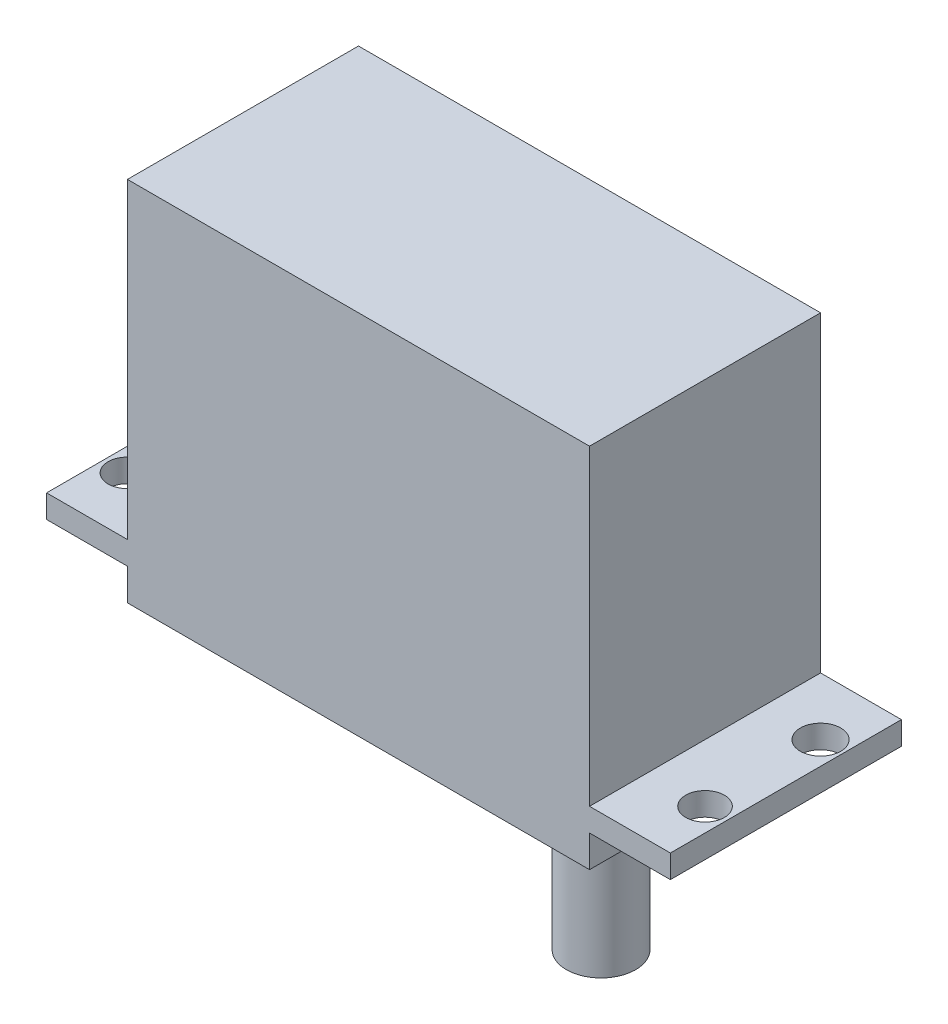
ISO-10303-21;
HEADER;
FILE_DESCRIPTION(('STEP AP214'),'2;1');
FILE_NAME('part.step','',(''),(''),'','','');
FILE_SCHEMA(('AUTOMOTIVE_DESIGN { 1 0 10303 214 1 1 1 1 }'));
ENDSEC;
DATA;
#1=APPLICATION_CONTEXT('core data for automotive mechanical design processes');
#2=APPLICATION_PROTOCOL_DEFINITION('international standard','automotive_design',2000,#1);
#3=PRODUCT_CONTEXT('',#1,'mechanical');
#4=PRODUCT('Part','Part','',(#3));
#5=PRODUCT_RELATED_PRODUCT_CATEGORY('part','',(#4));
#6=PRODUCT_DEFINITION_FORMATION('','',#4);
#7=PRODUCT_DEFINITION_CONTEXT('part definition',#1,'design');
#8=PRODUCT_DEFINITION('design','',#6,#7);
#9=PRODUCT_DEFINITION_SHAPE('','',#8);
#10=(LENGTH_UNIT() NAMED_UNIT(*) SI_UNIT(.MILLI.,.METRE.));
#11=(NAMED_UNIT(*) PLANE_ANGLE_UNIT() SI_UNIT($,.RADIAN.));
#12=(NAMED_UNIT(*) SI_UNIT($,.STERADIAN.) SOLID_ANGLE_UNIT());
#13=UNCERTAINTY_MEASURE_WITH_UNIT(LENGTH_MEASURE(1.E-05),#10,'distance_accuracy_value','');
#14=(GEOMETRIC_REPRESENTATION_CONTEXT(3) GLOBAL_UNCERTAINTY_ASSIGNED_CONTEXT((#13)) GLOBAL_UNIT_ASSIGNED_CONTEXT((#10,
#11,#12)) REPRESENTATION_CONTEXT('',''));
#15=CARTESIAN_POINT('',(0.,0.,0.));
#16=DIRECTION('',(0.,0.,1.));
#17=DIRECTION('',(1.,0.,0.));
#18=AXIS2_PLACEMENT_3D('',#15,#16,#17);
#19=CARTESIAN_POINT('',(0.,-15.,0.));
#20=DIRECTION('',(0.,-1.,0.));
#21=DIRECTION('',(0.,0.,-1.));
#22=AXIS2_PLACEMENT_3D('',#19,#20,#21);
#23=PLANE('',#22);
#24=CARTESIAN_POINT('',(-22.8039215686274,-15.,3.94117647058824));
#25=DIRECTION('',(0.,-1.,0.));
#26=DIRECTION('',(0.,0.,-1.));
#27=AXIS2_PLACEMENT_3D('',#24,#25,#26);
#28=CIRCLE('',#27,1.67357151142241);
#29=CARTESIAN_POINT('',(-22.8039215686274,-15.,2.26760495916582));
#30=VERTEX_POINT('',#29);
#31=EDGE_CURVE('E257',#30,#30,#28,.T.);
#32=ORIENTED_EDGE('',*,*,#31,.F.);
#33=EDGE_LOOP('',(#32));
#34=FACE_BOUND('',#33,.T.);
#35=CARTESIAN_POINT('',(-22.8039215686274,-15.,-6.05882352941176));
#36=DIRECTION('',(0.,-1.,0.));
#37=DIRECTION('',(0.,0.,-1.));
#38=AXIS2_PLACEMENT_3D('',#35,#36,#37);
#39=CIRCLE('',#38,1.749374087696);
#40=CARTESIAN_POINT('',(-22.8039215686274,-15.,-7.80819761710777));
#41=VERTEX_POINT('',#40);
#42=EDGE_CURVE('E269',#41,#41,#39,.T.);
#43=ORIENTED_EDGE('',*,*,#42,.F.);
#44=EDGE_LOOP('',(#43));
#45=FACE_BOUND('',#44,.T.);
#46=DIRECTION('',(1.,0.,0.));
#47=VECTOR('',#46,1.);
#48=CARTESIAN_POINT('',(-24.8039215686274,-15.,-11.0588235294118));
#49=LINE('',#48,#47);
#50=CARTESIAN_POINT('',(-24.8039215686274,-15.,-11.0588235294118));
#51=VERTEX_POINT('',#50);
#52=CARTESIAN_POINT('',(-17.8039215686274,-15.,-11.0588235294118));
#53=VERTEX_POINT('',#52);
#54=EDGE_CURVE('E177',#51,#53,#49,.T.);
#55=ORIENTED_EDGE('',*,*,#54,.T.);
#56=DIRECTION('',(0.,0.,1.));
#57=VECTOR('',#56,1.);
#58=CARTESIAN_POINT('',(-17.8039215686274,-15.,0.));
#59=LINE('',#58,#57);
#60=CARTESIAN_POINT('',(-17.8039215686274,-15.,8.94117647058824));
#61=VERTEX_POINT('',#60);
#62=EDGE_CURVE('E11',#53,#61,#59,.T.);
#63=ORIENTED_EDGE('',*,*,#62,.T.);
#64=DIRECTION('',(-1.,0.,0.));
#65=VECTOR('',#64,1.);
#66=CARTESIAN_POINT('',(-24.8039215686274,-15.,8.94117647058824));
#67=LINE('',#66,#65);
#68=CARTESIAN_POINT('',(-24.8039215686274,-15.,8.94117647058824));
#69=VERTEX_POINT('',#68);
#70=EDGE_CURVE('E183',#61,#69,#67,.T.);
#71=ORIENTED_EDGE('',*,*,#70,.T.);
#72=DIRECTION('',(0.,0.,-1.));
#73=VECTOR('',#72,1.);
#74=CARTESIAN_POINT('',(-24.8039215686274,-15.,8.94117647058824));
#75=LINE('',#74,#73);
#76=EDGE_CURVE('E171',#69,#51,#75,.T.);
#77=ORIENTED_EDGE('',*,*,#76,.T.);
#78=EDGE_LOOP('',(#55,#63,#71,#77));
#79=FACE_BOUND('',#78,.T.);
#80=ADVANCED_FACE('F45',(#34,#45,#79),#23,.T.);
#81=CARTESIAN_POINT('',(27.1960784313726,-15.,3.94117647058824));
#82=DIRECTION('',(0.,1.,0.));
#83=DIRECTION('',(0.,0.,-1.));
#84=AXIS2_PLACEMENT_3D('',#81,#82,#83);
#85=CIRCLE('',#84,1.67357151142241);
#86=CARTESIAN_POINT('',(27.1960784313726,-15.,2.26760495916582));
#87=VERTEX_POINT('',#86);
#88=EDGE_CURVE('E263',#87,#87,#85,.T.);
#89=ORIENTED_EDGE('',*,*,#88,.T.);
#90=EDGE_LOOP('',(#89));
#91=FACE_BOUND('',#90,.T.);
#92=CARTESIAN_POINT('',(27.1960784313726,-15.,-6.05882352941176));
#93=DIRECTION('',(0.,1.,0.));
#94=DIRECTION('',(0.,0.,-1.));
#95=AXIS2_PLACEMENT_3D('',#92,#93,#94);
#96=CIRCLE('',#95,1.749374087696);
#97=CARTESIAN_POINT('',(27.1960784313726,-15.,-7.80819761710777));
#98=VERTEX_POINT('',#97);
#99=EDGE_CURVE('E271',#98,#98,#96,.T.);
#100=ORIENTED_EDGE('',*,*,#99,.T.);
#101=EDGE_LOOP('',(#100));
#102=FACE_BOUND('',#101,.T.);
#103=CARTESIAN_POINT('',(29.1960784313726,-15.,8.94117647058824));
#104=VERTEX_POINT('',#103);
#105=CARTESIAN_POINT('',(22.1960784313726,-15.,8.94117647058824));
#106=VERTEX_POINT('',#105);
#107=EDGE_CURVE('E63',#104,#106,#67,.T.);
#108=ORIENTED_EDGE('',*,*,#107,.T.);
#109=DIRECTION('',(0.,0.,-1.));
#110=VECTOR('',#109,1.);
#111=CARTESIAN_POINT('',(22.1960784313726,-15.,0.));
#112=LINE('',#111,#110);
#113=CARTESIAN_POINT('',(22.1960784313726,-15.,-11.0588235294118));
#114=VERTEX_POINT('',#113);
#115=EDGE_CURVE('E55',#106,#114,#112,.T.);
#116=ORIENTED_EDGE('',*,*,#115,.T.);
#117=CARTESIAN_POINT('',(29.1960784313726,-15.,-11.0588235294118));
#118=VERTEX_POINT('',#117);
#119=EDGE_CURVE('E175',#114,#118,#49,.T.);
#120=ORIENTED_EDGE('',*,*,#119,.T.);
#121=DIRECTION('',(0.,0.,1.));
#122=VECTOR('',#121,1.);
#123=CARTESIAN_POINT('',(29.1960784313726,-15.,8.94117647058824));
#124=LINE('',#123,#122);
#125=EDGE_CURVE('E180',#118,#104,#124,.T.);
#126=ORIENTED_EDGE('',*,*,#125,.T.);
#127=EDGE_LOOP('',(#108,#116,#120,#126));
#128=FACE_BOUND('',#127,.T.);
#129=ADVANCED_FACE('F313',(#91,#102,#128),#23,.T.);
#130=CARTESIAN_POINT('',(-17.8039215686274,14.,-11.0588235294118));
#131=DIRECTION('',(1.,0.,0.));
#132=DIRECTION('',(0.,0.,-1.));
#133=AXIS2_PLACEMENT_3D('',#130,#131,#132);
#134=PLANE('',#133);
#135=DIRECTION('',(0.,0.,-1.));
#136=VECTOR('',#135,1.);
#137=CARTESIAN_POINT('',(-17.8039215686274,-13.,-11.0588235294118));
#138=LINE('',#137,#136);
#139=CARTESIAN_POINT('',(-17.8039215686274,-13.,8.94117647058824));
#140=VERTEX_POINT('',#139);
#141=CARTESIAN_POINT('',(-17.8039215686274,-13.,-11.0588235294118));
#142=VERTEX_POINT('',#141);
#143=EDGE_CURVE('E217',#140,#142,#138,.T.);
#144=ORIENTED_EDGE('',*,*,#143,.F.);
#145=DIRECTION('',(0.,-1.,0.));
#146=VECTOR('',#145,1.);
#147=CARTESIAN_POINT('',(-17.8039215686274,14.,8.94117647058824));
#148=LINE('',#147,#146);
#149=CARTESIAN_POINT('',(-17.8039215686274,14.,8.94117647058824));
#150=VERTEX_POINT('',#149);
#151=EDGE_CURVE('E243',#150,#140,#148,.T.);
#152=ORIENTED_EDGE('',*,*,#151,.F.);
#153=DIRECTION('',(0.,0.,1.));
#154=VECTOR('',#153,1.);
#155=CARTESIAN_POINT('',(-17.8039215686274,14.,-11.0588235294118));
#156=LINE('',#155,#154);
#157=CARTESIAN_POINT('',(-17.8039215686274,14.,-11.0588235294118));
#158=VERTEX_POINT('',#157);
#159=EDGE_CURVE('E221',#158,#150,#156,.T.);
#160=ORIENTED_EDGE('',*,*,#159,.F.);
#161=DIRECTION('',(0.,-1.,0.));
#162=VECTOR('',#161,1.);
#163=CARTESIAN_POINT('',(-17.8039215686274,14.,-11.0588235294118));
#164=LINE('',#163,#162);
#165=EDGE_CURVE('E234',#158,#142,#164,.T.);
#166=ORIENTED_EDGE('',*,*,#165,.T.);
#167=EDGE_LOOP('',(#144,#152,#160,#166));
#168=FACE_BOUND('',#167,.T.);
#169=ADVANCED_FACE('F47',(#168),#134,.F.);
#170=CARTESIAN_POINT('',(22.1960784313726,14.,-11.0588235294118));
#171=DIRECTION('',(-1.,0.,0.));
#172=DIRECTION('',(0.,0.,1.));
#173=AXIS2_PLACEMENT_3D('',#170,#171,#172);
#174=PLANE('',#173);
#175=DIRECTION('',(0.,0.,1.));
#176=VECTOR('',#175,1.);
#177=CARTESIAN_POINT('',(22.1960784313726,-13.,-11.0588235294118));
#178=LINE('',#177,#176);
#179=CARTESIAN_POINT('',(22.1960784313726,-13.,-11.0588235294118));
#180=VERTEX_POINT('',#179);
#181=CARTESIAN_POINT('',(22.1960784313726,-13.,8.94117647058824));
#182=VERTEX_POINT('',#181);
#183=EDGE_CURVE('E213',#180,#182,#178,.T.);
#184=ORIENTED_EDGE('',*,*,#183,.F.);
#185=DIRECTION('',(0.,-1.,0.));
#186=VECTOR('',#185,1.);
#187=CARTESIAN_POINT('',(22.1960784313726,14.,-11.0588235294118));
#188=LINE('',#187,#186);
#189=CARTESIAN_POINT('',(22.1960784313726,14.,-11.0588235294118));
#190=VERTEX_POINT('',#189);
#191=EDGE_CURVE('E237',#190,#180,#188,.T.);
#192=ORIENTED_EDGE('',*,*,#191,.F.);
#193=DIRECTION('',(0.,0.,-1.));
#194=VECTOR('',#193,1.);
#195=CARTESIAN_POINT('',(22.1960784313726,14.,-11.0588235294118));
#196=LINE('',#195,#194);
#197=CARTESIAN_POINT('',(22.1960784313726,14.,8.94117647058824));
#198=VERTEX_POINT('',#197);
#199=EDGE_CURVE('E228',#198,#190,#196,.T.);
#200=ORIENTED_EDGE('',*,*,#199,.F.);
#201=DIRECTION('',(0.,-1.,0.));
#202=VECTOR('',#201,1.);
#203=CARTESIAN_POINT('',(22.1960784313726,14.,8.94117647058824));
#204=LINE('',#203,#202);
#205=EDGE_CURVE('E240',#198,#182,#204,.T.);
#206=ORIENTED_EDGE('',*,*,#205,.T.);
#207=EDGE_LOOP('',(#184,#192,#200,#206));
#208=FACE_BOUND('',#207,.T.);
#209=ADVANCED_FACE('F341',(#208),#174,.F.);
#210=CARTESIAN_POINT('',(-17.8039215686274,14.,8.94117647058824));
#211=DIRECTION('',(0.,0.,-1.));
#212=DIRECTION('',(-1.,0.,0.));
#213=AXIS2_PLACEMENT_3D('',#210,#211,#212);
#214=PLANE('',#213);
#215=ORIENTED_EDGE('',*,*,#151,.T.);
#216=DIRECTION('',(-1.,0.,0.));
#217=VECTOR('',#216,1.);
#218=CARTESIAN_POINT('',(-24.8039215686274,-13.,8.94117647058824));
#219=LINE('',#218,#217);
#220=CARTESIAN_POINT('',(-24.8039215686274,-13.,8.94117647058824));
#221=VERTEX_POINT('',#220);
#222=EDGE_CURVE('E194',#140,#221,#219,.T.);
#223=ORIENTED_EDGE('',*,*,#222,.T.);
#224=DIRECTION('',(0.,1.,0.));
#225=VECTOR('',#224,1.);
#226=CARTESIAN_POINT('',(-24.8039215686274,-15.,8.94117647058824));
#227=LINE('',#226,#225);
#228=EDGE_CURVE('E185',#69,#221,#227,.T.);
#229=ORIENTED_EDGE('',*,*,#228,.F.);
#230=ORIENTED_EDGE('',*,*,#70,.F.);
#231=DIRECTION('',(0.,1.,0.));
#232=VECTOR('',#231,1.);
#233=CARTESIAN_POINT('',(-17.8039215686274,-17.75,8.94117647058824));
#234=LINE('',#233,#232);
#235=CARTESIAN_POINT('',(-17.8039215686274,-17.75,8.94117647058824));
#236=VERTEX_POINT('',#235);
#237=EDGE_CURVE('E292',#236,#61,#234,.T.);
#238=ORIENTED_EDGE('',*,*,#237,.F.);
#239=DIRECTION('',(-1.,0.,0.));
#240=VECTOR('',#239,1.);
#241=CARTESIAN_POINT('',(-17.8039215686274,-17.75,8.94117647058824));
#242=LINE('',#241,#240);
#243=CARTESIAN_POINT('',(22.1960784313726,-17.75,8.94117647058824));
#244=VERTEX_POINT('',#243);
#245=EDGE_CURVE('E150',#244,#236,#242,.T.);
#246=ORIENTED_EDGE('',*,*,#245,.F.);
#247=DIRECTION('',(0.,1.,0.));
#248=VECTOR('',#247,1.);
#249=CARTESIAN_POINT('',(22.1960784313726,-17.75,8.94117647058824));
#250=LINE('',#249,#248);
#251=EDGE_CURVE('E167',#244,#106,#250,.T.);
#252=ORIENTED_EDGE('',*,*,#251,.T.);
#253=ORIENTED_EDGE('',*,*,#107,.F.);
#254=DIRECTION('',(0.,1.,0.));
#255=VECTOR('',#254,1.);
#256=CARTESIAN_POINT('',(29.1960784313726,-15.,8.94117647058824));
#257=LINE('',#256,#255);
#258=CARTESIAN_POINT('',(29.1960784313726,-13.,8.94117647058824));
#259=VERTEX_POINT('',#258);
#260=EDGE_CURVE('E201',#104,#259,#257,.T.);
#261=ORIENTED_EDGE('',*,*,#260,.T.);
#262=EDGE_CURVE('E176',#259,#182,#219,.T.);
#263=ORIENTED_EDGE('',*,*,#262,.T.);
#264=ORIENTED_EDGE('',*,*,#205,.F.);
#265=DIRECTION('',(1.,0.,0.));
#266=VECTOR('',#265,1.);
#267=CARTESIAN_POINT('',(-17.8039215686274,14.,8.94117647058824));
#268=LINE('',#267,#266);
#269=EDGE_CURVE('E225',#150,#198,#268,.T.);
#270=ORIENTED_EDGE('',*,*,#269,.F.);
#271=EDGE_LOOP('',(#215,#223,#229,#230,#238,#246,#252,#253,#261,#263,#264,#270));
#272=FACE_BOUND('',#271,.T.);
#273=ADVANCED_FACE('F298',(#272),#214,.F.);
#274=CARTESIAN_POINT('',(-17.8039215686274,14.,-11.0588235294118));
#275=DIRECTION('',(0.,0.,1.));
#276=DIRECTION('',(1.,0.,0.));
#277=AXIS2_PLACEMENT_3D('',#274,#275,#276);
#278=PLANE('',#277);
#279=ORIENTED_EDGE('',*,*,#191,.T.);
#280=DIRECTION('',(1.,0.,0.));
#281=VECTOR('',#280,1.);
#282=CARTESIAN_POINT('',(-24.8039215686274,-13.,-11.0588235294118));
#283=LINE('',#282,#281);
#284=CARTESIAN_POINT('',(29.1960784313726,-13.,-11.0588235294118));
#285=VERTEX_POINT('',#284);
#286=EDGE_CURVE('E165',#180,#285,#283,.T.);
#287=ORIENTED_EDGE('',*,*,#286,.T.);
#288=DIRECTION('',(0.,1.,0.));
#289=VECTOR('',#288,1.);
#290=CARTESIAN_POINT('',(29.1960784313726,-15.,-11.0588235294118));
#291=LINE('',#290,#289);
#292=EDGE_CURVE('E205',#118,#285,#291,.T.);
#293=ORIENTED_EDGE('',*,*,#292,.F.);
#294=ORIENTED_EDGE('',*,*,#119,.F.);
#295=DIRECTION('',(0.,1.,0.));
#296=VECTOR('',#295,1.);
#297=CARTESIAN_POINT('',(22.1960784313726,-17.75,-11.0588235294118));
#298=LINE('',#297,#296);
#299=CARTESIAN_POINT('',(22.1960784313726,-17.75,-11.0588235294118));
#300=VERTEX_POINT('',#299);
#301=EDGE_CURVE('E140',#300,#114,#298,.T.);
#302=ORIENTED_EDGE('',*,*,#301,.F.);
#303=DIRECTION('',(1.,0.,0.));
#304=VECTOR('',#303,1.);
#305=CARTESIAN_POINT('',(-17.8039215686274,-17.75,-11.0588235294118));
#306=LINE('',#305,#304);
#307=CARTESIAN_POINT('',(-17.8039215686274,-17.75,-11.0588235294118));
#308=VERTEX_POINT('',#307);
#309=EDGE_CURVE('E134',#308,#300,#306,.T.);
#310=ORIENTED_EDGE('',*,*,#309,.F.);
#311=DIRECTION('',(0.,1.,0.));
#312=VECTOR('',#311,1.);
#313=CARTESIAN_POINT('',(-17.8039215686274,-17.75,-11.0588235294118));
#314=LINE('',#313,#312);
#315=EDGE_CURVE('E138',#308,#53,#314,.T.);
#316=ORIENTED_EDGE('',*,*,#315,.T.);
#317=ORIENTED_EDGE('',*,*,#54,.F.);
#318=DIRECTION('',(0.,1.,0.));
#319=VECTOR('',#318,1.);
#320=CARTESIAN_POINT('',(-24.8039215686274,-15.,-11.0588235294118));
#321=LINE('',#320,#319);
#322=CARTESIAN_POINT('',(-24.8039215686274,-13.,-11.0588235294118));
#323=VERTEX_POINT('',#322);
#324=EDGE_CURVE('E209',#51,#323,#321,.T.);
#325=ORIENTED_EDGE('',*,*,#324,.T.);
#326=EDGE_CURVE('E187',#323,#142,#283,.T.);
#327=ORIENTED_EDGE('',*,*,#326,.T.);
#328=ORIENTED_EDGE('',*,*,#165,.F.);
#329=DIRECTION('',(-1.,0.,0.));
#330=VECTOR('',#329,1.);
#331=CARTESIAN_POINT('',(-17.8039215686274,14.,-11.0588235294118));
#332=LINE('',#331,#330);
#333=EDGE_CURVE('E231',#190,#158,#332,.T.);
#334=ORIENTED_EDGE('',*,*,#333,.F.);
#335=EDGE_LOOP('',(#279,#287,#293,#294,#302,#310,#316,#317,#325,#327,#328,#334));
#336=FACE_BOUND('',#335,.T.);
#337=ADVANCED_FACE('F136',(#336),#278,.F.);
#338=CARTESIAN_POINT('',(0.,14.,0.));
#339=DIRECTION('',(0.,1.,0.));
#340=DIRECTION('',(0.,0.,1.));
#341=AXIS2_PLACEMENT_3D('',#338,#339,#340);
#342=PLANE('',#341);
#343=ORIENTED_EDGE('',*,*,#159,.T.);
#344=ORIENTED_EDGE('',*,*,#269,.T.);
#345=ORIENTED_EDGE('',*,*,#199,.T.);
#346=ORIENTED_EDGE('',*,*,#333,.T.);
#347=EDGE_LOOP('',(#343,#344,#345,#346));
#348=FACE_BOUND('',#347,.T.);
#349=ADVANCED_FACE('F327',(#348),#342,.T.);
#350=CARTESIAN_POINT('',(0.,-13.,0.));
#351=DIRECTION('',(0.,-1.,0.));
#352=DIRECTION('',(0.,0.,-1.));
#353=AXIS2_PLACEMENT_3D('',#350,#351,#352);
#354=PLANE('',#353);
#355=CARTESIAN_POINT('',(-22.8039215686274,-13.,3.94117647058824));
#356=DIRECTION('',(0.,-1.,0.));
#357=DIRECTION('',(0.,0.,-1.));
#358=AXIS2_PLACEMENT_3D('',#355,#356,#357);
#359=CIRCLE('',#358,1.67357151142241);
#360=CARTESIAN_POINT('',(-22.8039215686274,-13.,2.26760495916582));
#361=VERTEX_POINT('',#360);
#362=EDGE_CURVE('E256',#361,#361,#359,.T.);
#363=ORIENTED_EDGE('',*,*,#362,.T.);
#364=EDGE_LOOP('',(#363));
#365=FACE_BOUND('',#364,.T.);
#366=CARTESIAN_POINT('',(-22.8039215686274,-13.,-6.05882352941176));
#367=DIRECTION('',(0.,-1.,0.));
#368=DIRECTION('',(0.,0.,-1.));
#369=AXIS2_PLACEMENT_3D('',#366,#367,#368);
#370=CIRCLE('',#369,1.749374087696);
#371=CARTESIAN_POINT('',(-22.8039215686274,-13.,-7.80819761710777));
#372=VERTEX_POINT('',#371);
#373=EDGE_CURVE('E252',#372,#372,#370,.T.);
#374=ORIENTED_EDGE('',*,*,#373,.T.);
#375=EDGE_LOOP('',(#374));
#376=FACE_BOUND('',#375,.T.);
#377=ORIENTED_EDGE('',*,*,#222,.F.);
#378=ORIENTED_EDGE('',*,*,#143,.T.);
#379=ORIENTED_EDGE('',*,*,#326,.F.);
#380=DIRECTION('',(0.,0.,-1.));
#381=VECTOR('',#380,1.);
#382=CARTESIAN_POINT('',(-24.8039215686274,-13.,8.94117647058824));
#383=LINE('',#382,#381);
#384=EDGE_CURVE('E160',#221,#323,#383,.T.);
#385=ORIENTED_EDGE('',*,*,#384,.F.);
#386=EDGE_LOOP('',(#377,#378,#379,#385));
#387=FACE_BOUND('',#386,.T.);
#388=ADVANCED_FACE('F324',(#365,#376,#387),#354,.F.);
#389=CARTESIAN_POINT('',(27.1960784313726,-13.,3.94117647058824));
#390=DIRECTION('',(0.,-1.,0.));
#391=DIRECTION('',(0.,0.,-1.));
#392=AXIS2_PLACEMENT_3D('',#389,#390,#391);
#393=CIRCLE('',#392,1.67357151142241);
#394=CARTESIAN_POINT('',(27.1960784313726,-13.,2.26760495916582));
#395=VERTEX_POINT('',#394);
#396=EDGE_CURVE('E49',#395,#395,#393,.F.);
#397=ORIENTED_EDGE('',*,*,#396,.F.);
#398=EDGE_LOOP('',(#397));
#399=FACE_BOUND('',#398,.T.);
#400=CARTESIAN_POINT('',(27.1960784313726,-13.,-6.05882352941176));
#401=DIRECTION('',(0.,-1.,0.));
#402=DIRECTION('',(0.,0.,-1.));
#403=AXIS2_PLACEMENT_3D('',#400,#401,#402);
#404=CIRCLE('',#403,1.749374087696);
#405=CARTESIAN_POINT('',(27.1960784313726,-13.,-7.80819761710777));
#406=VERTEX_POINT('',#405);
#407=EDGE_CURVE('E260',#406,#406,#404,.F.);
#408=ORIENTED_EDGE('',*,*,#407,.F.);
#409=EDGE_LOOP('',(#408));
#410=FACE_BOUND('',#409,.T.);
#411=ORIENTED_EDGE('',*,*,#286,.F.);
#412=ORIENTED_EDGE('',*,*,#183,.T.);
#413=ORIENTED_EDGE('',*,*,#262,.F.);
#414=DIRECTION('',(0.,0.,1.));
#415=VECTOR('',#414,1.);
#416=CARTESIAN_POINT('',(29.1960784313726,-13.,8.94117647058824));
#417=LINE('',#416,#415);
#418=EDGE_CURVE('E191',#285,#259,#417,.T.);
#419=ORIENTED_EDGE('',*,*,#418,.F.);
#420=EDGE_LOOP('',(#411,#412,#413,#419));
#421=FACE_BOUND('',#420,.T.);
#422=ADVANCED_FACE('F326',(#399,#410,#421),#354,.F.);
#423=CARTESIAN_POINT('',(-24.8039215686274,-15.,8.94117647058824));
#424=DIRECTION('',(1.,0.,0.));
#425=DIRECTION('',(0.,0.,-1.));
#426=AXIS2_PLACEMENT_3D('',#423,#424,#425);
#427=PLANE('',#426);
#428=ORIENTED_EDGE('',*,*,#384,.T.);
#429=ORIENTED_EDGE('',*,*,#324,.F.);
#430=ORIENTED_EDGE('',*,*,#76,.F.);
#431=ORIENTED_EDGE('',*,*,#228,.T.);
#432=EDGE_LOOP('',(#428,#429,#430,#431));
#433=FACE_BOUND('',#432,.T.);
#434=ADVANCED_FACE('F331',(#433),#427,.F.);
#435=CARTESIAN_POINT('',(29.1960784313726,-15.,8.94117647058824));
#436=DIRECTION('',(-1.,0.,0.));
#437=DIRECTION('',(0.,0.,1.));
#438=AXIS2_PLACEMENT_3D('',#435,#436,#437);
#439=PLANE('',#438);
#440=ORIENTED_EDGE('',*,*,#418,.T.);
#441=ORIENTED_EDGE('',*,*,#260,.F.);
#442=ORIENTED_EDGE('',*,*,#125,.F.);
#443=ORIENTED_EDGE('',*,*,#292,.T.);
#444=EDGE_LOOP('',(#440,#441,#442,#443));
#445=FACE_BOUND('',#444,.T.);
#446=ADVANCED_FACE('F310',(#445),#439,.F.);
#447=CARTESIAN_POINT('',(-17.8039215686274,-17.75,8.94117647058824));
#448=DIRECTION('',(1.,0.,0.));
#449=DIRECTION('',(0.,0.,-1.));
#450=AXIS2_PLACEMENT_3D('',#447,#448,#449);
#451=PLANE('',#450);
#452=ORIENTED_EDGE('',*,*,#62,.F.);
#453=ORIENTED_EDGE('',*,*,#315,.F.);
#454=DIRECTION('',(0.,0.,-1.));
#455=VECTOR('',#454,1.);
#456=CARTESIAN_POINT('',(-17.8039215686274,-17.75,8.94117647058824));
#457=LINE('',#456,#455);
#458=EDGE_CURVE('E145',#236,#308,#457,.T.);
#459=ORIENTED_EDGE('',*,*,#458,.F.);
#460=ORIENTED_EDGE('',*,*,#237,.T.);
#461=EDGE_LOOP('',(#452,#453,#459,#460));
#462=FACE_BOUND('',#461,.T.);
#463=ADVANCED_FACE('F158',(#462),#451,.F.);
#464=CARTESIAN_POINT('',(22.1960784313726,-17.75,8.94117647058824));
#465=DIRECTION('',(-1.,0.,0.));
#466=DIRECTION('',(0.,0.,1.));
#467=AXIS2_PLACEMENT_3D('',#464,#465,#466);
#468=PLANE('',#467);
#469=ORIENTED_EDGE('',*,*,#115,.F.);
#470=ORIENTED_EDGE('',*,*,#251,.F.);
#471=DIRECTION('',(0.,0.,1.));
#472=VECTOR('',#471,1.);
#473=CARTESIAN_POINT('',(22.1960784313726,-17.75,8.94117647058824));
#474=LINE('',#473,#472);
#475=EDGE_CURVE('E144',#300,#244,#474,.T.);
#476=ORIENTED_EDGE('',*,*,#475,.F.);
#477=ORIENTED_EDGE('',*,*,#301,.T.);
#478=EDGE_LOOP('',(#469,#470,#476,#477));
#479=FACE_BOUND('',#478,.T.);
#480=ADVANCED_FACE('F300',(#479),#468,.F.);
#481=CARTESIAN_POINT('',(0.,-17.75,0.));
#482=DIRECTION('',(0.,-1.,0.));
#483=DIRECTION('',(0.,0.,-1.));
#484=AXIS2_PLACEMENT_3D('',#481,#482,#483);
#485=PLANE('',#484);
#486=CARTESIAN_POINT('',(13.1960784313726,-17.75,-1.05882352941176));
#487=DIRECTION('',(0.,-1.,0.));
#488=DIRECTION('',(0.,0.,-1.));
#489=AXIS2_PLACEMENT_3D('',#486,#487,#488);
#490=CIRCLE('',#489,3.);
#491=CARTESIAN_POINT('',(13.1960784313726,-17.75,-4.05882352941176));
#492=VERTEX_POINT('',#491);
#493=EDGE_CURVE('E155',#492,#492,#490,.F.);
#494=ORIENTED_EDGE('',*,*,#493,.T.);
#495=EDGE_LOOP('',(#494));
#496=FACE_BOUND('',#495,.T.);
#497=ORIENTED_EDGE('',*,*,#458,.T.);
#498=ORIENTED_EDGE('',*,*,#309,.T.);
#499=ORIENTED_EDGE('',*,*,#475,.T.);
#500=ORIENTED_EDGE('',*,*,#245,.T.);
#501=EDGE_LOOP('',(#497,#498,#499,#500));
#502=FACE_BOUND('',#501,.T.);
#503=ADVANCED_FACE('F148',(#496,#502),#485,.T.);
#504=CARTESIAN_POINT('',(13.1960784313726,-33.25,-1.05882352941176));
#505=DIRECTION('',(0.,1.,0.));
#506=DIRECTION('',(0.,0.,1.));
#507=AXIS2_PLACEMENT_3D('',#504,#505,#506);
#508=CYLINDRICAL_SURFACE('',#507,3.);
#509=ORIENTED_EDGE('',*,*,#493,.F.);
#510=EDGE_LOOP('',(#509));
#511=FACE_BOUND('',#510,.T.);
#512=CARTESIAN_POINT('',(13.1960784313726,-33.25,-1.05882352941176));
#513=DIRECTION('',(0.,-1.,0.));
#514=DIRECTION('',(0.,0.,-1.));
#515=AXIS2_PLACEMENT_3D('',#512,#513,#514);
#516=CIRCLE('',#515,3.);
#517=CARTESIAN_POINT('',(13.1960784313726,-33.25,-4.05882352941176));
#518=VERTEX_POINT('',#517);
#519=EDGE_CURVE('E251',#518,#518,#516,.T.);
#520=ORIENTED_EDGE('',*,*,#519,.F.);
#521=EDGE_LOOP('',(#520));
#522=FACE_BOUND('',#521,.T.);
#523=ADVANCED_FACE('F307',(#511,#522),#508,.T.);
#524=CARTESIAN_POINT('',(13.1960784313726,-33.25,-1.05882352941176));
#525=DIRECTION('',(0.,-1.,0.));
#526=DIRECTION('',(0.,0.,-1.));
#527=AXIS2_PLACEMENT_3D('',#524,#525,#526);
#528=PLANE('',#527);
#529=ORIENTED_EDGE('',*,*,#519,.T.);
#530=EDGE_LOOP('',(#529));
#531=FACE_BOUND('',#530,.T.);
#532=ADVANCED_FACE('F381',(#531),#528,.T.);
#533=CARTESIAN_POINT('',(-22.8039215686274,-5.5,-6.05882352941176));
#534=DIRECTION('',(0.,-1.,0.));
#535=DIRECTION('',(0.,0.,-1.));
#536=AXIS2_PLACEMENT_3D('',#533,#534,#535);
#537=CYLINDRICAL_SURFACE('',#536,1.749374087696);
#538=ORIENTED_EDGE('',*,*,#42,.T.);
#539=EDGE_LOOP('',(#538));
#540=FACE_BOUND('',#539,.T.);
#541=ORIENTED_EDGE('',*,*,#373,.F.);
#542=EDGE_LOOP('',(#541));
#543=FACE_BOUND('',#542,.T.);
#544=ADVANCED_FACE('F390',(#540,#543),#537,.F.);
#545=CARTESIAN_POINT('',(-22.8039215686274,-5.5,3.94117647058824));
#546=DIRECTION('',(0.,-1.,0.));
#547=DIRECTION('',(0.,0.,-1.));
#548=AXIS2_PLACEMENT_3D('',#545,#546,#547);
#549=CYLINDRICAL_SURFACE('',#548,1.67357151142241);
#550=ORIENTED_EDGE('',*,*,#31,.T.);
#551=EDGE_LOOP('',(#550));
#552=FACE_BOUND('',#551,.T.);
#553=ORIENTED_EDGE('',*,*,#362,.F.);
#554=EDGE_LOOP('',(#553));
#555=FACE_BOUND('',#554,.T.);
#556=ADVANCED_FACE('F400',(#552,#555),#549,.F.);
#557=CARTESIAN_POINT('',(27.1960784313726,-5.5,-6.05882352941176));
#558=DIRECTION('',(0.,-1.,0.));
#559=DIRECTION('',(0.,0.,-1.));
#560=AXIS2_PLACEMENT_3D('',#557,#558,#559);
#561=CYLINDRICAL_SURFACE('',#560,1.749374087696);
#562=ORIENTED_EDGE('',*,*,#99,.F.);
#563=EDGE_LOOP('',(#562));
#564=FACE_BOUND('',#563,.T.);
#565=ORIENTED_EDGE('',*,*,#407,.T.);
#566=EDGE_LOOP('',(#565));
#567=FACE_BOUND('',#566,.T.);
#568=ADVANCED_FACE('F410',(#564,#567),#561,.F.);
#569=CARTESIAN_POINT('',(27.1960784313726,-5.5,3.94117647058824));
#570=DIRECTION('',(0.,-1.,0.));
#571=DIRECTION('',(0.,0.,-1.));
#572=AXIS2_PLACEMENT_3D('',#569,#570,#571);
#573=CYLINDRICAL_SURFACE('',#572,1.67357151142241);
#574=ORIENTED_EDGE('',*,*,#88,.F.);
#575=EDGE_LOOP('',(#574));
#576=FACE_BOUND('',#575,.T.);
#577=ORIENTED_EDGE('',*,*,#396,.T.);
#578=EDGE_LOOP('',(#577));
#579=FACE_BOUND('',#578,.T.);
#580=ADVANCED_FACE('F420',(#576,#579),#573,.F.);
#581=CLOSED_SHELL('',(#80,#129,#169,#209,#273,#337,#349,#388,#422,#434,#446,#463,#480,#503,#523,
#532,#544,#556,#568,#580));
#582=MANIFOLD_SOLID_BREP('B2',#581);
#583=ADVANCED_BREP_SHAPE_REPRESENTATION('',(#18,#582),#14);
#584=SHAPE_DEFINITION_REPRESENTATION(#9,#583);
ENDSEC;
END-ISO-10303-21;
